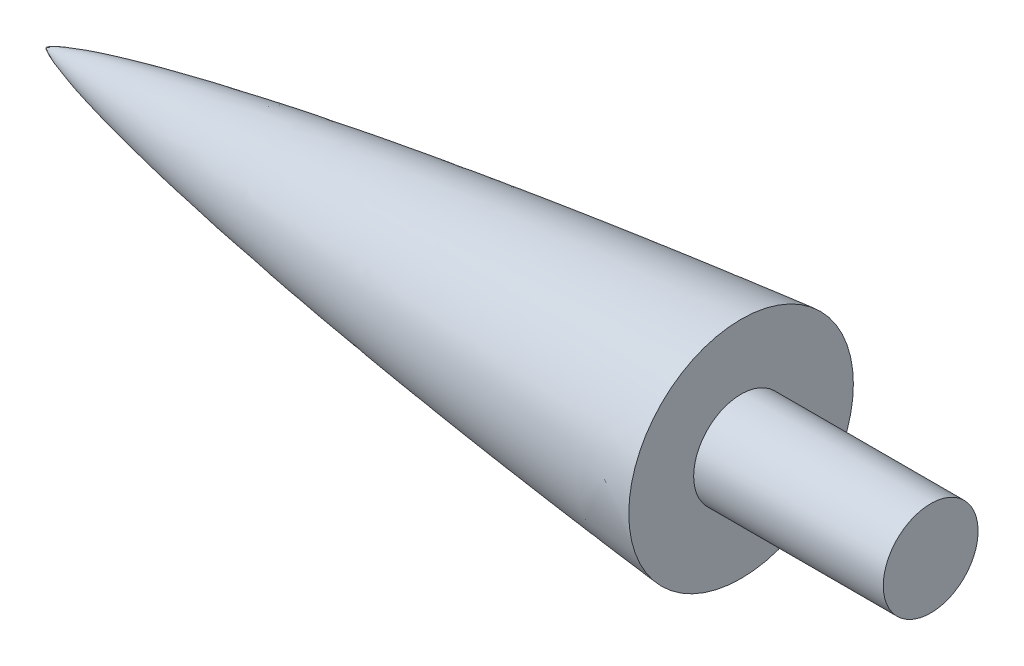
ISO-10303-21;
HEADER;
FILE_DESCRIPTION(('STEP AP214'),'2;1');
FILE_NAME('part.step','',(''),(''),'','','');
FILE_SCHEMA(('AUTOMOTIVE_DESIGN { 1 0 10303 214 1 1 1 1 }'));
ENDSEC;
DATA;
#1=APPLICATION_CONTEXT('core data for automotive mechanical design processes');
#2=APPLICATION_PROTOCOL_DEFINITION('international standard','automotive_design',2000,#1);
#3=PRODUCT_CONTEXT('',#1,'mechanical');
#4=PRODUCT('Part','Part','',(#3));
#5=PRODUCT_RELATED_PRODUCT_CATEGORY('part','',(#4));
#6=PRODUCT_DEFINITION_FORMATION('','',#4);
#7=PRODUCT_DEFINITION_CONTEXT('part definition',#1,'design');
#8=PRODUCT_DEFINITION('design','',#6,#7);
#9=PRODUCT_DEFINITION_SHAPE('','',#8);
#10=(LENGTH_UNIT() NAMED_UNIT(*) SI_UNIT(.MILLI.,.METRE.));
#11=(NAMED_UNIT(*) PLANE_ANGLE_UNIT() SI_UNIT($,.RADIAN.));
#12=(NAMED_UNIT(*) SI_UNIT($,.STERADIAN.) SOLID_ANGLE_UNIT());
#13=UNCERTAINTY_MEASURE_WITH_UNIT(LENGTH_MEASURE(1.E-05),#10,'distance_accuracy_value','');
#14=(GEOMETRIC_REPRESENTATION_CONTEXT(3) GLOBAL_UNCERTAINTY_ASSIGNED_CONTEXT((#13)) GLOBAL_UNIT_ASSIGNED_CONTEXT((#10,
#11,#12)) REPRESENTATION_CONTEXT('',''));
#15=CARTESIAN_POINT('',(0.,0.,0.));
#16=DIRECTION('',(0.,0.,1.));
#17=DIRECTION('',(1.,0.,0.));
#18=AXIS2_PLACEMENT_3D('',#15,#16,#17);
#19=CARTESIAN_POINT('',(0.,0.,0.));
#20=DIRECTION('',(-1.,0.,0.));
#21=DIRECTION('',(0.,0.,1.));
#22=AXIS2_PLACEMENT_3D('',#19,#20,#21);
#23=CYLINDRICAL_SURFACE('',#22,12.7000000000567);
#24=CARTESIAN_POINT('',(186.200000000954,0.,0.));
#25=DIRECTION('',(-1.,0.,0.));
#26=DIRECTION('',(0.,0.,1.));
#27=AXIS2_PLACEMENT_3D('',#24,#25,#26);
#28=CIRCLE('',#27,12.7000000000567);
#29=CARTESIAN_POINT('',(186.200000000954,0.,12.7000000000567));
#30=VERTEX_POINT('',#29);
#31=EDGE_CURVE('E11',#30,#30,#28,.T.);
#32=ORIENTED_EDGE('',*,*,#31,.F.);
#33=EDGE_LOOP('',(#32));
#34=FACE_BOUND('',#33,.T.);
#35=CARTESIAN_POINT('',(237.,0.,0.));
#36=DIRECTION('',(-1.,0.,0.));
#37=DIRECTION('',(0.,0.,1.));
#38=AXIS2_PLACEMENT_3D('',#35,#36,#37);
#39=CIRCLE('',#38,12.7000000000567);
#40=CARTESIAN_POINT('',(237.,0.,12.7000000000567));
#41=VERTEX_POINT('',#40);
#42=EDGE_CURVE('E65',#41,#41,#39,.T.);
#43=ORIENTED_EDGE('',*,*,#42,.T.);
#44=EDGE_LOOP('',(#43));
#45=FACE_BOUND('',#44,.T.);
#46=ADVANCED_FACE('F45',(#34,#45),#23,.T.);
#47=CARTESIAN_POINT('',(186.200000001049,0.,-12.7000000000567));
#48=DIRECTION('',(-1.,0.,0.));
#49=DIRECTION('',(0.,0.,1.));
#50=AXIS2_PLACEMENT_3D('',#47,#48,#49);
#51=PLANE('',#50);
#52=CARTESIAN_POINT('',(186.200000001145,0.,0.));
#53=DIRECTION('',(-1.,0.,0.));
#54=DIRECTION('',(0.,0.,1.));
#55=AXIS2_PLACEMENT_3D('',#52,#53,#54);
#56=CIRCLE('',#55,30.0883136883646);
#57=CARTESIAN_POINT('',(186.200000001145,0.,30.0883136883646));
#58=VERTEX_POINT('',#57);
#59=EDGE_CURVE('E52',#58,#58,#56,.T.);
#60=ORIENTED_EDGE('',*,*,#59,.F.);
#61=EDGE_LOOP('',(#60));
#62=FACE_BOUND('',#61,.T.);
#63=ORIENTED_EDGE('',*,*,#31,.T.);
#64=EDGE_LOOP('',(#63));
#65=FACE_BOUND('',#64,.T.);
#66=ADVANCED_FACE('F59',(#62,#65),#51,.F.);
#67=CARTESIAN_POINT('',(186.200000001145,0.,-30.0883136883646));
#68=CARTESIAN_POINT('',(184.662971424628,0.,-29.9360181715078));
#69=CARTESIAN_POINT('',(181.666346717272,0.,-29.6364737192005));
#70=CARTESIAN_POINT('',(175.523614971029,0.,-29.0159042782995));
#71=CARTESIAN_POINT('',(169.646330146062,0.,-28.4012453177309));
#72=CARTESIAN_POINT('',(162.350717259059,0.,-27.6291417523323));
#73=CARTESIAN_POINT('',(155.957915428262,0.,-26.9290458014569));
#74=CARTESIAN_POINT('',(149.822499027921,0.,-26.2470064090754));
#75=CARTESIAN_POINT('',(144.890346289457,0.,-25.6831064526579));
#76=CARTESIAN_POINT('',(139.767576372426,0.,-25.0907134671738));
#77=CARTESIAN_POINT('',(134.748260742157,0.,-24.4987808151364));
#78=CARTESIAN_POINT('',(128.827755929785,0.,-23.7870760056075));
#79=CARTESIAN_POINT('',(120.416788561494,0.,-22.748698481216));
#80=CARTESIAN_POINT('',(110.306660176923,0.,-21.4569063214844));
#81=CARTESIAN_POINT('',(100.217499799868,0.,-20.1080276888654));
#82=CARTESIAN_POINT('',(90.1289857377931,0.,-18.6929599150165));
#83=CARTESIAN_POINT('',(80.0530968604483,0.,-17.2204855992826));
#84=CARTESIAN_POINT('',(69.9842133569524,0.,-15.685468886403));
#85=CARTESIAN_POINT('',(58.2546243039946,0.,-13.7926184580206));
#86=CARTESIAN_POINT('',(44.8769199409669,0.,-11.4581725142367));
#87=CARTESIAN_POINT('',(32.2495273386552,0.,-9.03876525182264));
#88=CARTESIAN_POINT('',(21.4648413108543,0.,-6.72634054097822));
#89=CARTESIAN_POINT('',(13.1269914187275,0.,-4.68585335350249));
#90=CARTESIAN_POINT('',(7.61856896221334,0.,-3.12625448266157));
#91=CARTESIAN_POINT('',(4.42634666405197,0.,-2.08422359728799));
#92=CARTESIAN_POINT('',(2.58338533581623,0.,-1.39200847490003));
#93=CARTESIAN_POINT('',(1.54712218475917,0.,-0.947112727935367));
#94=CARTESIAN_POINT('',(0.957250278649622,0.,-0.660220610188244));
#95=CARTESIAN_POINT('',(0.610871438593723,0.,-0.471010948380786));
#96=CARTESIAN_POINT('',(0.397734036828899,0.,-0.341277270911482));
#97=CARTESIAN_POINT('',(0.267185047543695,0.,-0.253150012297434));
#98=CARTESIAN_POINT('',(0.179553821065551,0.,-0.187856384042749));
#99=CARTESIAN_POINT('',(0.115237936396998,0.,-0.134879990474137));
#100=CARTESIAN_POINT('',(0.0707306214338072,0.,-0.0942658520030431));
#101=CARTESIAN_POINT('',(0.0341739519684571,0.,-0.0553943353361106));
#102=CARTESIAN_POINT('',(0.0112299634362194,0.,-0.0255725621589443));
#103=CARTESIAN_POINT('',(0.00315828580025109,0.,-0.00882981282056777));
#104=CARTESIAN_POINT('',(0.,0.,0.));
#105=B_SPLINE_CURVE_WITH_KNOTS('',4,(#67,#68,#69,#70,#71,#72,#73,#74,#75,#76,#77,#78,#79,#80,
#81,#82,#83,#84,#85,#86,#87,#88,#89,#90,#91,#92,#93,#94,#95,#96,#97,#98,#99,#100,#101,#102,#103,
#104),.UNSPECIFIED.,.F.,.F.,(5,1,1,1,1,1,1,1,1,1,1,1,1,1,1,1,1,1,1,1,1,1,1,1,1,1,1,1,1,1,1,1,1,
1,5),(0.,0.0326800172704892,0.0653600345409784,0.0980400518970579,0.130720069253138,
0.163400086664618,0.196080104076098,0.212420112795143,0.228760121514187,0.261440138952276,
0.294120156378947,0.326800173805618,0.392160208584161,0.457520243403109,0.49020026114963,
0.522880278896152,0.58824031370917,0.653600346231373,0.71896038084712,0.784320414471676,
0.835770045474472,0.865933512127484,0.884199710440621,0.894518548865506,0.900404619222185,
0.903824338819586,0.905904728312181,0.907142958580277,0.908000978390024,0.908626655132852,
0.90893630350937,0.909245951885888,0.909605246272393,0.909784893465646,0.909964540658898),.UNSPECIFIED.);
#106=CARTESIAN_POINT('',(0.,0.,0.));
#107=DIRECTION('',(-1.,0.,0.));
#108=AXIS1_PLACEMENT('',#106,#107);
#109=SURFACE_OF_REVOLUTION('',#105,#108);
#110=CARTESIAN_POINT('',(0.,0.,0.));
#111=VERTEX_POINT('',#110);
#112=VERTEX_LOOP('',#111);
#113=FACE_BOUND('',#112,.T.);
#114=ORIENTED_EDGE('',*,*,#59,.T.);
#115=EDGE_LOOP('',(#114));
#116=FACE_BOUND('',#115,.T.);
#117=ADVANCED_FACE('F55',(#113,#116),#109,.T.);
#118=CARTESIAN_POINT('',(237.,0.,0.));
#119=DIRECTION('',(-1.,0.,0.));
#120=DIRECTION('',(0.,0.,1.));
#121=AXIS2_PLACEMENT_3D('',#118,#119,#120);
#122=PLANE('',#121);
#123=ORIENTED_EDGE('',*,*,#42,.F.);
#124=EDGE_LOOP('',(#123));
#125=FACE_BOUND('',#124,.T.);
#126=ADVANCED_FACE('F58',(#125),#122,.F.);
#127=CLOSED_SHELL('',(#46,#66,#117,#126));
#128=MANIFOLD_SOLID_BREP('B2',#127);
#129=ADVANCED_BREP_SHAPE_REPRESENTATION('',(#18,#128),#14);
#130=SHAPE_DEFINITION_REPRESENTATION(#9,#129);
ENDSEC;
END-ISO-10303-21;
